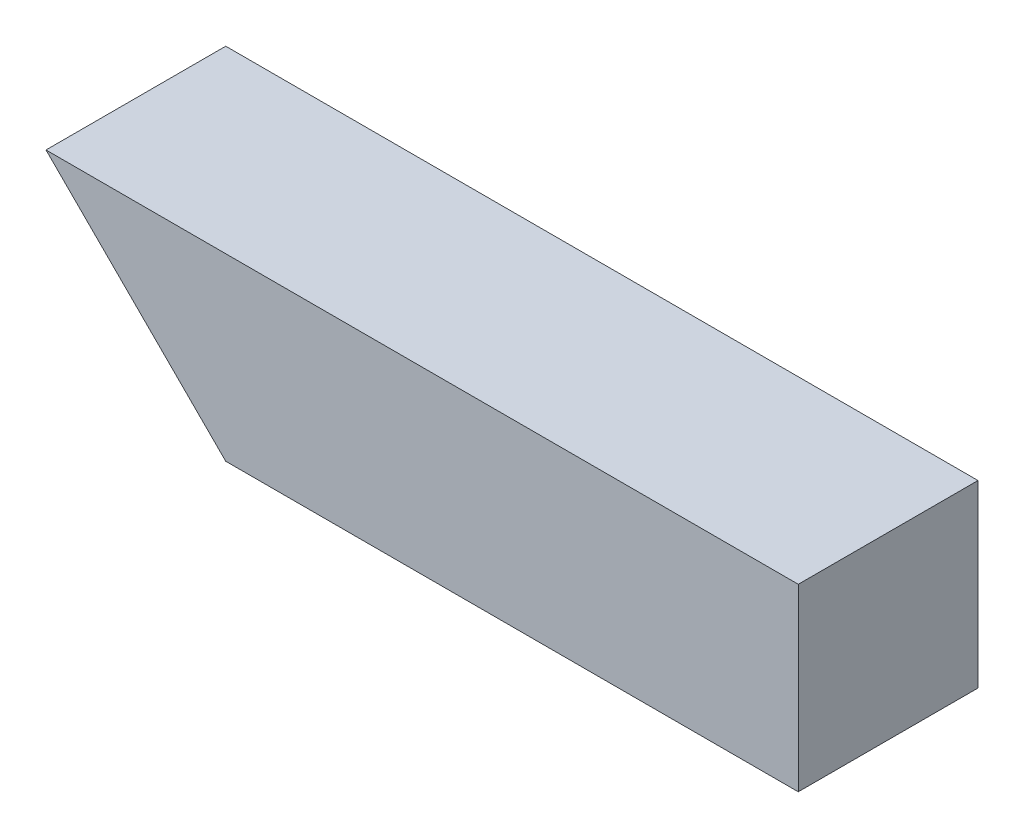
ISO-10303-21;
HEADER;
FILE_DESCRIPTION(('STEP AP214'),'2;1');
FILE_NAME('part.step','',(''),(''),'','','');
FILE_SCHEMA(('AUTOMOTIVE_DESIGN { 1 0 10303 214 1 1 1 1 }'));
ENDSEC;
DATA;
#1=APPLICATION_CONTEXT('core data for automotive mechanical design processes');
#2=APPLICATION_PROTOCOL_DEFINITION('international standard','automotive_design',2000,#1);
#3=PRODUCT_CONTEXT('',#1,'mechanical');
#4=PRODUCT('Part','Part','',(#3));
#5=PRODUCT_RELATED_PRODUCT_CATEGORY('part','',(#4));
#6=PRODUCT_DEFINITION_FORMATION('','',#4);
#7=PRODUCT_DEFINITION_CONTEXT('part definition',#1,'design');
#8=PRODUCT_DEFINITION('design','',#6,#7);
#9=PRODUCT_DEFINITION_SHAPE('','',#8);
#10=(LENGTH_UNIT() NAMED_UNIT(*) SI_UNIT(.MILLI.,.METRE.));
#11=(NAMED_UNIT(*) PLANE_ANGLE_UNIT() SI_UNIT($,.RADIAN.));
#12=(NAMED_UNIT(*) SI_UNIT($,.STERADIAN.) SOLID_ANGLE_UNIT());
#13=UNCERTAINTY_MEASURE_WITH_UNIT(LENGTH_MEASURE(1.E-05),#10,'distance_accuracy_value','');
#14=(GEOMETRIC_REPRESENTATION_CONTEXT(3) GLOBAL_UNCERTAINTY_ASSIGNED_CONTEXT((#13)) GLOBAL_UNIT_ASSIGNED_CONTEXT((#10,
#11,#12)) REPRESENTATION_CONTEXT('',''));
#15=CARTESIAN_POINT('',(0.,0.,0.));
#16=DIRECTION('',(0.,0.,1.));
#17=DIRECTION('',(1.,0.,0.));
#18=AXIS2_PLACEMENT_3D('',#15,#16,#17);
#19=CARTESIAN_POINT('',(159.46490586,0.,0.));
#20=DIRECTION('',(0.,0.,-1.));
#21=DIRECTION('',(0.,1.,0.));
#22=AXIS2_PLACEMENT_3D('',#19,#20,#21);
#23=PLANE('',#22);
#24=DIRECTION('',(-0.707106781186548,0.707106781186548,0.));
#25=VECTOR('',#24,1.);
#26=CARTESIAN_POINT('',(79.73245293,-79.73245293,0.));
#27=LINE('',#26,#25);
#28=CARTESIAN_POINT('',(38.1,-38.1,0.));
#29=VERTEX_POINT('',#28);
#30=CARTESIAN_POINT('',(0.,0.,0.));
#31=VERTEX_POINT('',#30);
#32=EDGE_CURVE('E58',#29,#31,#27,.T.);
#33=ORIENTED_EDGE('',*,*,#32,.F.);
#34=DIRECTION('',(-1.,0.,0.));
#35=VECTOR('',#34,1.);
#36=CARTESIAN_POINT('',(159.46490586,-38.1,0.));
#37=LINE('',#36,#35);
#38=CARTESIAN_POINT('',(159.46490586,-38.1,0.));
#39=VERTEX_POINT('',#38);
#40=EDGE_CURVE('E51',#39,#29,#37,.T.);
#41=ORIENTED_EDGE('',*,*,#40,.F.);
#42=DIRECTION('',(0.,-1.,0.));
#43=VECTOR('',#42,1.);
#44=CARTESIAN_POINT('',(159.46490586,0.,0.));
#45=LINE('',#44,#43);
#46=CARTESIAN_POINT('',(159.46490586,0.,0.));
#47=VERTEX_POINT('',#46);
#48=EDGE_CURVE('E109',#47,#39,#45,.T.);
#49=ORIENTED_EDGE('',*,*,#48,.F.);
#50=DIRECTION('',(-1.,0.,0.));
#51=VECTOR('',#50,1.);
#52=CARTESIAN_POINT('',(159.46490586,0.,0.));
#53=LINE('',#52,#51);
#54=EDGE_CURVE('E118',#47,#31,#53,.T.);
#55=ORIENTED_EDGE('',*,*,#54,.T.);
#56=EDGE_LOOP('',(#33,#41,#49,#55));
#57=FACE_BOUND('',#56,.T.);
#58=ADVANCED_FACE('F43',(#57),#23,.F.);
#59=CARTESIAN_POINT('',(159.46490586,0.,-38.1));
#60=DIRECTION('',(0.,0.,1.));
#61=DIRECTION('',(0.,-1.,0.));
#62=AXIS2_PLACEMENT_3D('',#59,#60,#61);
#63=PLANE('',#62);
#64=DIRECTION('',(0.707106781186548,-0.707106781186548,0.));
#65=VECTOR('',#64,1.);
#66=CARTESIAN_POINT('',(79.73245293,-79.73245293,-38.1));
#67=LINE('',#66,#65);
#68=CARTESIAN_POINT('',(0.,0.,-38.1));
#69=VERTEX_POINT('',#68);
#70=CARTESIAN_POINT('',(38.1,-38.1,-38.1));
#71=VERTEX_POINT('',#70);
#72=EDGE_CURVE('E11',#69,#71,#67,.T.);
#73=ORIENTED_EDGE('',*,*,#72,.F.);
#74=DIRECTION('',(-1.,0.,0.));
#75=VECTOR('',#74,1.);
#76=CARTESIAN_POINT('',(159.46490586,0.,-38.1));
#77=LINE('',#76,#75);
#78=CARTESIAN_POINT('',(159.46490586,0.,-38.1));
#79=VERTEX_POINT('',#78);
#80=EDGE_CURVE('E99',#79,#69,#77,.T.);
#81=ORIENTED_EDGE('',*,*,#80,.F.);
#82=DIRECTION('',(0.,1.,0.));
#83=VECTOR('',#82,1.);
#84=CARTESIAN_POINT('',(159.46490586,0.,-38.1));
#85=LINE('',#84,#83);
#86=CARTESIAN_POINT('',(159.46490586,-38.1,-38.1));
#87=VERTEX_POINT('',#86);
#88=EDGE_CURVE('E97',#87,#79,#85,.T.);
#89=ORIENTED_EDGE('',*,*,#88,.F.);
#90=DIRECTION('',(-1.,0.,0.));
#91=VECTOR('',#90,1.);
#92=CARTESIAN_POINT('',(159.46490586,-38.1,-38.1));
#93=LINE('',#92,#91);
#94=EDGE_CURVE('E93',#87,#71,#93,.T.);
#95=ORIENTED_EDGE('',*,*,#94,.T.);
#96=EDGE_LOOP('',(#73,#81,#89,#95));
#97=FACE_BOUND('',#96,.T.);
#98=ADVANCED_FACE('F95',(#97),#63,.F.);
#99=CARTESIAN_POINT('',(159.46490586,-38.1,0.));
#100=DIRECTION('',(0.,1.,0.));
#101=DIRECTION('',(0.,0.,1.));
#102=AXIS2_PLACEMENT_3D('',#99,#100,#101);
#103=PLANE('',#102);
#104=ORIENTED_EDGE('',*,*,#40,.T.);
#105=DIRECTION('',(0.,0.,-1.));
#106=VECTOR('',#105,1.);
#107=CARTESIAN_POINT('',(38.1,-38.1,210.402427657018));
#108=LINE('',#107,#106);
#109=EDGE_CURVE('E102',#29,#71,#108,.T.);
#110=ORIENTED_EDGE('',*,*,#109,.T.);
#111=ORIENTED_EDGE('',*,*,#94,.F.);
#112=DIRECTION('',(0.,0.,-1.));
#113=VECTOR('',#112,1.);
#114=CARTESIAN_POINT('',(159.46490586,-38.1,0.));
#115=LINE('',#114,#113);
#116=EDGE_CURVE('E88',#39,#87,#115,.T.);
#117=ORIENTED_EDGE('',*,*,#116,.F.);
#118=EDGE_LOOP('',(#104,#110,#111,#117));
#119=FACE_BOUND('',#118,.T.);
#120=ADVANCED_FACE('F103',(#119),#103,.F.);
#121=CARTESIAN_POINT('',(159.46490586,0.,0.));
#122=DIRECTION('',(0.,-1.,0.));
#123=DIRECTION('',(0.,0.,-1.));
#124=AXIS2_PLACEMENT_3D('',#121,#122,#123);
#125=PLANE('',#124);
#126=DIRECTION('',(0.,0.,1.));
#127=VECTOR('',#126,1.);
#128=CARTESIAN_POINT('',(0.,0.,0.));
#129=LINE('',#128,#127);
#130=EDGE_CURVE('E82',#69,#31,#129,.T.);
#131=ORIENTED_EDGE('',*,*,#130,.T.);
#132=ORIENTED_EDGE('',*,*,#54,.F.);
#133=DIRECTION('',(0.,0.,1.));
#134=VECTOR('',#133,1.);
#135=CARTESIAN_POINT('',(159.46490586,0.,0.));
#136=LINE('',#135,#134);
#137=EDGE_CURVE('E67',#79,#47,#136,.T.);
#138=ORIENTED_EDGE('',*,*,#137,.F.);
#139=ORIENTED_EDGE('',*,*,#80,.T.);
#140=EDGE_LOOP('',(#131,#132,#138,#139));
#141=FACE_BOUND('',#140,.T.);
#142=ADVANCED_FACE('F137',(#141),#125,.F.);
#143=CARTESIAN_POINT('',(159.46490586,0.,0.));
#144=DIRECTION('',(1.,0.,0.));
#145=DIRECTION('',(0.,0.,-1.));
#146=AXIS2_PLACEMENT_3D('',#143,#144,#145);
#147=PLANE('',#146);
#148=ORIENTED_EDGE('',*,*,#48,.T.);
#149=ORIENTED_EDGE('',*,*,#116,.T.);
#150=ORIENTED_EDGE('',*,*,#88,.T.);
#151=ORIENTED_EDGE('',*,*,#137,.T.);
#152=EDGE_LOOP('',(#148,#149,#150,#151));
#153=FACE_BOUND('',#152,.T.);
#154=ADVANCED_FACE('F127',(#153),#147,.T.);
#155=CARTESIAN_POINT('',(38.1,-38.1,210.402427657018));
#156=DIRECTION('',(-0.707106781186548,-0.707106781186548,0.));
#157=DIRECTION('',(0.707106781186548,-0.707106781186548,0.));
#158=AXIS2_PLACEMENT_3D('',#155,#156,#157);
#159=PLANE('',#158);
#160=ORIENTED_EDGE('',*,*,#109,.F.);
#161=ORIENTED_EDGE('',*,*,#32,.T.);
#162=ORIENTED_EDGE('',*,*,#130,.F.);
#163=ORIENTED_EDGE('',*,*,#72,.T.);
#164=EDGE_LOOP('',(#160,#161,#162,#163));
#165=FACE_BOUND('',#164,.T.);
#166=ADVANCED_FACE('F107',(#165),#159,.T.);
#167=CLOSED_SHELL('',(#58,#98,#120,#142,#154,#166));
#168=MANIFOLD_SOLID_BREP('B2',#167);
#169=ADVANCED_BREP_SHAPE_REPRESENTATION('',(#18,#168),#14);
#170=SHAPE_DEFINITION_REPRESENTATION(#9,#169);
ENDSEC;
END-ISO-10303-21;
